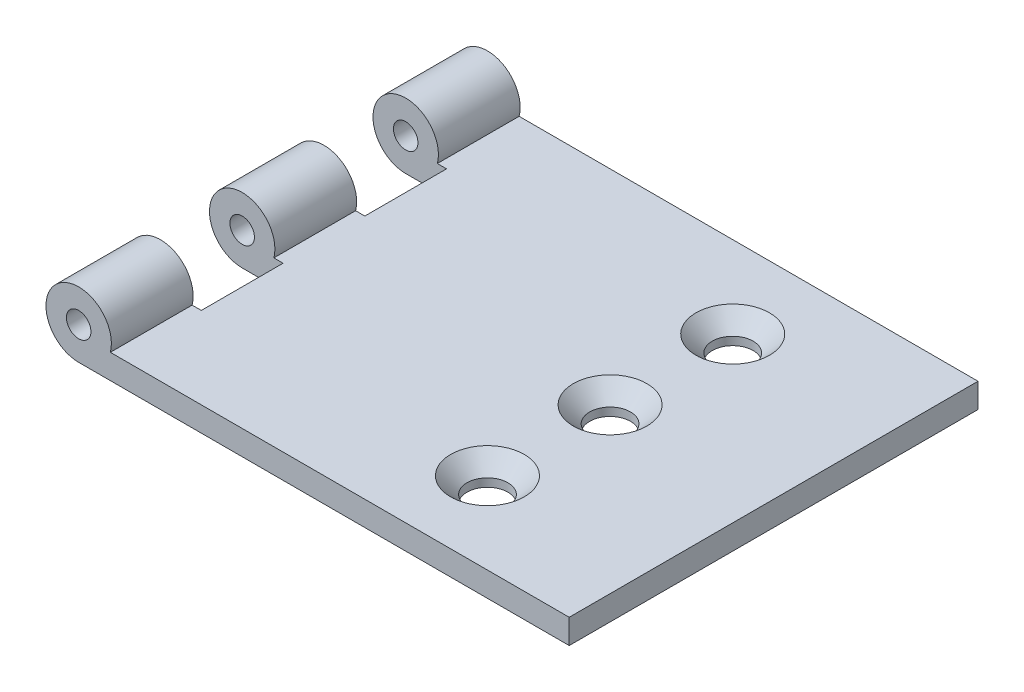
ISO-10303-21;
HEADER;
FILE_DESCRIPTION(('STEP AP214'),'2;1');
FILE_NAME('part.step','',(''),(''),'','','');
FILE_SCHEMA(('AUTOMOTIVE_DESIGN { 1 0 10303 214 1 1 1 1 }'));
ENDSEC;
DATA;
#1=APPLICATION_CONTEXT('core data for automotive mechanical design processes');
#2=APPLICATION_PROTOCOL_DEFINITION('international standard','automotive_design',2000,#1);
#3=PRODUCT_CONTEXT('',#1,'mechanical');
#4=PRODUCT('Part','Part','',(#3));
#5=PRODUCT_RELATED_PRODUCT_CATEGORY('part','',(#4));
#6=PRODUCT_DEFINITION_FORMATION('','',#4);
#7=PRODUCT_DEFINITION_CONTEXT('part definition',#1,'design');
#8=PRODUCT_DEFINITION('design','',#6,#7);
#9=PRODUCT_DEFINITION_SHAPE('','',#8);
#10=(LENGTH_UNIT() NAMED_UNIT(*) SI_UNIT(.MILLI.,.METRE.));
#11=(NAMED_UNIT(*) PLANE_ANGLE_UNIT() SI_UNIT($,.RADIAN.));
#12=(NAMED_UNIT(*) SI_UNIT($,.STERADIAN.) SOLID_ANGLE_UNIT());
#13=UNCERTAINTY_MEASURE_WITH_UNIT(LENGTH_MEASURE(1.E-05),#10,'distance_accuracy_value','');
#14=(GEOMETRIC_REPRESENTATION_CONTEXT(3) GLOBAL_UNCERTAINTY_ASSIGNED_CONTEXT((#13)) GLOBAL_UNIT_ASSIGNED_CONTEXT((#10,
#11,#12)) REPRESENTATION_CONTEXT('',''));
#15=CARTESIAN_POINT('',(0.,0.,0.));
#16=DIRECTION('',(0.,0.,1.));
#17=DIRECTION('',(1.,0.,0.));
#18=AXIS2_PLACEMENT_3D('',#15,#16,#17);
#19=CARTESIAN_POINT('',(40.,0.,15.));
#20=DIRECTION('',(0.,1.,0.));
#21=DIRECTION('',(0.,0.,1.));
#22=AXIS2_PLACEMENT_3D('',#19,#20,#21);
#23=CYLINDRICAL_SURFACE('',#22,2.5);
#24=CARTESIAN_POINT('',(40.,0.,15.));
#25=DIRECTION('',(0.,1.,0.));
#26=DIRECTION('',(0.,0.,1.));
#27=AXIS2_PLACEMENT_3D('',#24,#25,#26);
#28=CIRCLE('',#27,2.5);
#29=CARTESIAN_POINT('',(40.,0.,17.5));
#30=VERTEX_POINT('',#29);
#31=EDGE_CURVE('E307',#30,#30,#28,.T.);
#32=ORIENTED_EDGE('',*,*,#31,.F.);
#33=EDGE_LOOP('',(#32));
#34=FACE_BOUND('',#33,.T.);
#35=CARTESIAN_POINT('',(40.,1.,15.));
#36=DIRECTION('',(0.,-1.,0.));
#37=DIRECTION('',(0.,0.,-1.));
#38=AXIS2_PLACEMENT_3D('',#35,#36,#37);
#39=CIRCLE('',#38,2.5);
#40=CARTESIAN_POINT('',(40.,1.,12.5));
#41=VERTEX_POINT('',#40);
#42=EDGE_CURVE('E339',#41,#41,#39,.T.);
#43=ORIENTED_EDGE('',*,*,#42,.F.);
#44=EDGE_LOOP('',(#43));
#45=FACE_BOUND('',#44,.T.);
#46=ADVANCED_FACE('F51',(#34,#45),#23,.F.);
#47=CARTESIAN_POINT('',(40.,0.,0.));
#48=DIRECTION('',(0.,1.,0.));
#49=DIRECTION('',(0.,0.,1.));
#50=AXIS2_PLACEMENT_3D('',#47,#48,#49);
#51=CYLINDRICAL_SURFACE('',#50,2.5);
#52=CARTESIAN_POINT('',(40.,0.,0.));
#53=DIRECTION('',(0.,1.,0.));
#54=DIRECTION('',(0.,0.,1.));
#55=AXIS2_PLACEMENT_3D('',#52,#53,#54);
#56=CIRCLE('',#55,2.5);
#57=CARTESIAN_POINT('',(40.,0.,2.5));
#58=VERTEX_POINT('',#57);
#59=EDGE_CURVE('E311',#58,#58,#56,.T.);
#60=ORIENTED_EDGE('',*,*,#59,.F.);
#61=EDGE_LOOP('',(#60));
#62=FACE_BOUND('',#61,.T.);
#63=CARTESIAN_POINT('',(40.,1.,0.));
#64=DIRECTION('',(0.,-1.,0.));
#65=DIRECTION('',(0.,0.,-1.));
#66=AXIS2_PLACEMENT_3D('',#63,#64,#65);
#67=CIRCLE('',#66,2.5);
#68=CARTESIAN_POINT('',(40.,1.,-2.5));
#69=VERTEX_POINT('',#68);
#70=EDGE_CURVE('E331',#69,#69,#67,.T.);
#71=ORIENTED_EDGE('',*,*,#70,.F.);
#72=EDGE_LOOP('',(#71));
#73=FACE_BOUND('',#72,.T.);
#74=ADVANCED_FACE('F347',(#62,#73),#51,.F.);
#75=CARTESIAN_POINT('',(40.,0.,-15.));
#76=DIRECTION('',(0.,1.,0.));
#77=DIRECTION('',(0.,0.,1.));
#78=AXIS2_PLACEMENT_3D('',#75,#76,#77);
#79=CYLINDRICAL_SURFACE('',#78,2.5);
#80=CARTESIAN_POINT('',(40.,0.,-15.));
#81=DIRECTION('',(0.,1.,0.));
#82=DIRECTION('',(0.,0.,1.));
#83=AXIS2_PLACEMENT_3D('',#80,#81,#82);
#84=CIRCLE('',#83,2.5);
#85=CARTESIAN_POINT('',(40.,0.,-12.5));
#86=VERTEX_POINT('',#85);
#87=EDGE_CURVE('E316',#86,#86,#84,.T.);
#88=ORIENTED_EDGE('',*,*,#87,.F.);
#89=EDGE_LOOP('',(#88));
#90=FACE_BOUND('',#89,.T.);
#91=CARTESIAN_POINT('',(40.,1.,-15.));
#92=DIRECTION('',(0.,-1.,0.));
#93=DIRECTION('',(0.,0.,-1.));
#94=AXIS2_PLACEMENT_3D('',#91,#92,#93);
#95=CIRCLE('',#94,2.5);
#96=CARTESIAN_POINT('',(40.,1.,-17.5));
#97=VERTEX_POINT('',#96);
#98=EDGE_CURVE('E323',#97,#97,#95,.T.);
#99=ORIENTED_EDGE('',*,*,#98,.F.);
#100=EDGE_LOOP('',(#99));
#101=FACE_BOUND('',#100,.T.);
#102=ADVANCED_FACE('F352',(#90,#101),#79,.F.);
#103=CARTESIAN_POINT('',(0.,3.,0.));
#104=DIRECTION('',(0.,-1.,0.));
#105=DIRECTION('',(0.,0.,-1.));
#106=AXIS2_PLACEMENT_3D('',#103,#104,#105);
#107=PLANE('',#106);
#108=CARTESIAN_POINT('',(40.,3.,15.));
#109=DIRECTION('',(0.,-1.,0.));
#110=DIRECTION('',(0.,0.,-1.));
#111=AXIS2_PLACEMENT_3D('',#108,#109,#110);
#112=CIRCLE('',#111,4.5);
#113=CARTESIAN_POINT('',(40.,3.,10.5));
#114=VERTEX_POINT('',#113);
#115=EDGE_CURVE('E335',#114,#114,#112,.T.);
#116=ORIENTED_EDGE('',*,*,#115,.T.);
#117=EDGE_LOOP('',(#116));
#118=FACE_BOUND('',#117,.T.);
#119=CARTESIAN_POINT('',(40.,3.,0.));
#120=DIRECTION('',(0.,-1.,0.));
#121=DIRECTION('',(0.,0.,-1.));
#122=AXIS2_PLACEMENT_3D('',#119,#120,#121);
#123=CIRCLE('',#122,4.5);
#124=CARTESIAN_POINT('',(40.,3.,-4.5));
#125=VERTEX_POINT('',#124);
#126=EDGE_CURVE('E327',#125,#125,#123,.T.);
#127=ORIENTED_EDGE('',*,*,#126,.T.);
#128=EDGE_LOOP('',(#127));
#129=FACE_BOUND('',#128,.T.);
#130=CARTESIAN_POINT('',(40.,3.,-15.));
#131=DIRECTION('',(0.,-1.,0.));
#132=DIRECTION('',(0.,0.,-1.));
#133=AXIS2_PLACEMENT_3D('',#130,#131,#132);
#134=CIRCLE('',#133,4.5);
#135=CARTESIAN_POINT('',(40.,3.,-19.5));
#136=VERTEX_POINT('',#135);
#137=EDGE_CURVE('E312',#136,#136,#134,.T.);
#138=ORIENTED_EDGE('',*,*,#137,.T.);
#139=EDGE_LOOP('',(#138));
#140=FACE_BOUND('',#139,.T.);
#141=DIRECTION('',(0.,0.,-1.));
#142=VECTOR('',#141,1.);
#143=CARTESIAN_POINT('',(3.87298334620742,3.,5.));
#144=LINE('',#143,#142);
#145=CARTESIAN_POINT('',(3.87298334620742,3.,5.));
#146=VERTEX_POINT('',#145);
#147=CARTESIAN_POINT('',(3.87298334620742,3.,-5.));
#148=VERTEX_POINT('',#147);
#149=EDGE_CURVE('E73',#146,#148,#144,.T.);
#150=ORIENTED_EDGE('',*,*,#149,.F.);
#151=DIRECTION('',(1.,0.,0.));
#152=VECTOR('',#151,1.);
#153=CARTESIAN_POINT('',(5.,3.,5.));
#154=LINE('',#153,#152);
#155=CARTESIAN_POINT('',(5.,3.,5.));
#156=VERTEX_POINT('',#155);
#157=EDGE_CURVE('E210',#146,#156,#154,.T.);
#158=ORIENTED_EDGE('',*,*,#157,.T.);
#159=DIRECTION('',(0.,0.,1.));
#160=VECTOR('',#159,1.);
#161=CARTESIAN_POINT('',(5.,3.,15.));
#162=LINE('',#161,#160);
#163=CARTESIAN_POINT('',(5.,3.,15.));
#164=VERTEX_POINT('',#163);
#165=EDGE_CURVE('E213',#156,#164,#162,.T.);
#166=ORIENTED_EDGE('',*,*,#165,.T.);
#167=DIRECTION('',(-1.,0.,0.));
#168=VECTOR('',#167,1.);
#169=CARTESIAN_POINT('',(0.,3.,15.));
#170=LINE('',#169,#168);
#171=CARTESIAN_POINT('',(3.87298334620742,3.,15.));
#172=VERTEX_POINT('',#171);
#173=EDGE_CURVE('E216',#164,#172,#170,.T.);
#174=ORIENTED_EDGE('',*,*,#173,.T.);
#175=DIRECTION('',(0.,0.,-1.));
#176=VECTOR('',#175,1.);
#177=CARTESIAN_POINT('',(3.87298334620742,3.,25.));
#178=LINE('',#177,#176);
#179=CARTESIAN_POINT('',(3.87298334620742,3.,25.));
#180=VERTEX_POINT('',#179);
#181=EDGE_CURVE('E183',#180,#172,#178,.T.);
#182=ORIENTED_EDGE('',*,*,#181,.F.);
#183=DIRECTION('',(1.,0.,0.));
#184=VECTOR('',#183,1.);
#185=CARTESIAN_POINT('',(60.,3.,25.));
#186=LINE('',#185,#184);
#187=CARTESIAN_POINT('',(60.,3.,25.));
#188=VERTEX_POINT('',#187);
#189=EDGE_CURVE('E168',#180,#188,#186,.T.);
#190=ORIENTED_EDGE('',*,*,#189,.T.);
#191=DIRECTION('',(0.,0.,-1.));
#192=VECTOR('',#191,1.);
#193=CARTESIAN_POINT('',(60.,3.,-25.));
#194=LINE('',#193,#192);
#195=CARTESIAN_POINT('',(60.,3.,-25.));
#196=VERTEX_POINT('',#195);
#197=EDGE_CURVE('E221',#188,#196,#194,.T.);
#198=ORIENTED_EDGE('',*,*,#197,.T.);
#199=DIRECTION('',(-1.,0.,0.));
#200=VECTOR('',#199,1.);
#201=CARTESIAN_POINT('',(0.,3.,-25.));
#202=LINE('',#201,#200);
#203=CARTESIAN_POINT('',(3.87298334620742,3.,-25.));
#204=VERTEX_POINT('',#203);
#205=EDGE_CURVE('E224',#196,#204,#202,.T.);
#206=ORIENTED_EDGE('',*,*,#205,.T.);
#207=DIRECTION('',(0.,0.,-1.));
#208=VECTOR('',#207,1.);
#209=CARTESIAN_POINT('',(3.87298334620742,3.,-15.));
#210=LINE('',#209,#208);
#211=CARTESIAN_POINT('',(3.87298334620742,3.,-15.));
#212=VERTEX_POINT('',#211);
#213=EDGE_CURVE('E193',#212,#204,#210,.T.);
#214=ORIENTED_EDGE('',*,*,#213,.F.);
#215=DIRECTION('',(1.,0.,0.));
#216=VECTOR('',#215,1.);
#217=CARTESIAN_POINT('',(5.,3.,-15.));
#218=LINE('',#217,#216);
#219=CARTESIAN_POINT('',(5.,3.,-15.));
#220=VERTEX_POINT('',#219);
#221=EDGE_CURVE('E201',#212,#220,#218,.T.);
#222=ORIENTED_EDGE('',*,*,#221,.T.);
#223=DIRECTION('',(0.,0.,1.));
#224=VECTOR('',#223,1.);
#225=CARTESIAN_POINT('',(5.,3.,-5.));
#226=LINE('',#225,#224);
#227=CARTESIAN_POINT('',(5.,3.,-5.));
#228=VERTEX_POINT('',#227);
#229=EDGE_CURVE('E204',#220,#228,#226,.T.);
#230=ORIENTED_EDGE('',*,*,#229,.T.);
#231=DIRECTION('',(-1.,0.,0.));
#232=VECTOR('',#231,1.);
#233=CARTESIAN_POINT('',(0.,3.,-5.));
#234=LINE('',#233,#232);
#235=EDGE_CURVE('E69',#228,#148,#234,.T.);
#236=ORIENTED_EDGE('',*,*,#235,.T.);
#237=EDGE_LOOP('',(#150,#158,#166,#174,#182,#190,#198,#206,#214,#222,#230,#236));
#238=FACE_BOUND('',#237,.T.);
#239=ADVANCED_FACE('F381',(#118,#129,#140,#238),#107,.F.);
#240=CARTESIAN_POINT('',(5.,3.,-15.));
#241=DIRECTION('',(0.,0.,-1.));
#242=DIRECTION('',(-1.,0.,0.));
#243=AXIS2_PLACEMENT_3D('',#240,#241,#242);
#244=PLANE('',#243);
#245=CARTESIAN_POINT('',(0.,4.,-15.));
#246=DIRECTION('',(0.,0.,-1.));
#247=DIRECTION('',(-1.,0.,0.));
#248=AXIS2_PLACEMENT_3D('',#245,#246,#247);
#249=CIRCLE('',#248,1.5);
#250=CARTESIAN_POINT('',(-1.5,4.,-15.));
#251=VERTEX_POINT('',#250);
#252=EDGE_CURVE('E179',#251,#251,#249,.T.);
#253=ORIENTED_EDGE('',*,*,#252,.T.);
#254=EDGE_LOOP('',(#253));
#255=FACE_BOUND('',#254,.T.);
#256=CARTESIAN_POINT('',(0.,4.,-15.));
#257=DIRECTION('',(0.,0.,1.));
#258=DIRECTION('',(1.,0.,0.));
#259=AXIS2_PLACEMENT_3D('',#256,#257,#258);
#260=CIRCLE('',#259,4.);
#261=CARTESIAN_POINT('',(0.,0.,-15.));
#262=VERTEX_POINT('',#261);
#263=EDGE_CURVE('E189',#212,#262,#260,.T.);
#264=ORIENTED_EDGE('',*,*,#263,.T.);
#265=DIRECTION('',(1.,0.,0.));
#266=VECTOR('',#265,1.);
#267=CARTESIAN_POINT('',(5.,0.,-15.));
#268=LINE('',#267,#266);
#269=CARTESIAN_POINT('',(5.,0.,-15.));
#270=VERTEX_POINT('',#269);
#271=EDGE_CURVE('E231',#262,#270,#268,.T.);
#272=ORIENTED_EDGE('',*,*,#271,.T.);
#273=DIRECTION('',(0.,-1.,0.));
#274=VECTOR('',#273,1.);
#275=CARTESIAN_POINT('',(5.,3.,-15.));
#276=LINE('',#275,#274);
#277=EDGE_CURVE('E11',#220,#270,#276,.T.);
#278=ORIENTED_EDGE('',*,*,#277,.F.);
#279=ORIENTED_EDGE('',*,*,#221,.F.);
#280=EDGE_LOOP('',(#264,#272,#278,#279));
#281=FACE_BOUND('',#280,.T.);
#282=ADVANCED_FACE('F54',(#255,#281),#244,.F.);
#283=CARTESIAN_POINT('',(5.,3.,-5.));
#284=DIRECTION('',(1.,0.,0.));
#285=DIRECTION('',(0.,0.,-1.));
#286=AXIS2_PLACEMENT_3D('',#283,#284,#285);
#287=PLANE('',#286);
#288=DIRECTION('',(0.,0.,1.));
#289=VECTOR('',#288,1.);
#290=CARTESIAN_POINT('',(5.,0.,-5.));
#291=LINE('',#290,#289);
#292=CARTESIAN_POINT('',(5.,0.,-5.));
#293=VERTEX_POINT('',#292);
#294=EDGE_CURVE('E234',#270,#293,#291,.T.);
#295=ORIENTED_EDGE('',*,*,#294,.T.);
#296=DIRECTION('',(0.,-1.,0.));
#297=VECTOR('',#296,1.);
#298=CARTESIAN_POINT('',(5.,3.,-5.));
#299=LINE('',#298,#297);
#300=EDGE_CURVE('E62',#228,#293,#299,.T.);
#301=ORIENTED_EDGE('',*,*,#300,.F.);
#302=ORIENTED_EDGE('',*,*,#229,.F.);
#303=ORIENTED_EDGE('',*,*,#277,.T.);
#304=EDGE_LOOP('',(#295,#301,#302,#303));
#305=FACE_BOUND('',#304,.T.);
#306=ADVANCED_FACE('F421',(#305),#287,.F.);
#307=CARTESIAN_POINT('',(0.,3.,-5.));
#308=DIRECTION('',(0.,0.,1.));
#309=DIRECTION('',(1.,0.,0.));
#310=AXIS2_PLACEMENT_3D('',#307,#308,#309);
#311=PLANE('',#310);
#312=CARTESIAN_POINT('',(0.,4.,-5.));
#313=DIRECTION('',(0.,0.,1.));
#314=DIRECTION('',(1.,0.,0.));
#315=AXIS2_PLACEMENT_3D('',#312,#313,#314);
#316=CIRCLE('',#315,1.5);
#317=CARTESIAN_POINT('',(1.5,4.,-5.));
#318=VERTEX_POINT('',#317);
#319=EDGE_CURVE('E292',#318,#318,#316,.T.);
#320=ORIENTED_EDGE('',*,*,#319,.T.);
#321=EDGE_LOOP('',(#320));
#322=FACE_BOUND('',#321,.T.);
#323=DIRECTION('',(-1.,0.,0.));
#324=VECTOR('',#323,1.);
#325=CARTESIAN_POINT('',(0.,0.,-5.));
#326=LINE('',#325,#324);
#327=CARTESIAN_POINT('',(0.,0.,-5.));
#328=VERTEX_POINT('',#327);
#329=EDGE_CURVE('E237',#293,#328,#326,.T.);
#330=ORIENTED_EDGE('',*,*,#329,.T.);
#331=CARTESIAN_POINT('',(0.,4.,-5.));
#332=DIRECTION('',(0.,0.,1.));
#333=DIRECTION('',(1.,0.,0.));
#334=AXIS2_PLACEMENT_3D('',#331,#332,#333);
#335=CIRCLE('',#334,4.);
#336=EDGE_CURVE('E170',#148,#328,#335,.T.);
#337=ORIENTED_EDGE('',*,*,#336,.F.);
#338=ORIENTED_EDGE('',*,*,#235,.F.);
#339=ORIENTED_EDGE('',*,*,#300,.T.);
#340=EDGE_LOOP('',(#330,#337,#338,#339));
#341=FACE_BOUND('',#340,.T.);
#342=ADVANCED_FACE('F275',(#322,#341),#311,.F.);
#343=CARTESIAN_POINT('',(5.,3.,5.));
#344=DIRECTION('',(0.,0.,-1.));
#345=DIRECTION('',(-1.,0.,0.));
#346=AXIS2_PLACEMENT_3D('',#343,#344,#345);
#347=PLANE('',#346);
#348=CARTESIAN_POINT('',(0.,4.,5.));
#349=DIRECTION('',(0.,0.,-1.));
#350=DIRECTION('',(-1.,0.,0.));
#351=AXIS2_PLACEMENT_3D('',#348,#349,#350);
#352=CIRCLE('',#351,1.5);
#353=CARTESIAN_POINT('',(-1.5,4.,5.));
#354=VERTEX_POINT('',#353);
#355=EDGE_CURVE('E295',#354,#354,#352,.T.);
#356=ORIENTED_EDGE('',*,*,#355,.T.);
#357=EDGE_LOOP('',(#356));
#358=FACE_BOUND('',#357,.T.);
#359=ORIENTED_EDGE('',*,*,#157,.F.);
#360=CARTESIAN_POINT('',(0.,4.,5.));
#361=DIRECTION('',(0.,0.,1.));
#362=DIRECTION('',(1.,0.,0.));
#363=AXIS2_PLACEMENT_3D('',#360,#361,#362);
#364=CIRCLE('',#363,4.);
#365=CARTESIAN_POINT('',(0.,0.,5.));
#366=VERTEX_POINT('',#365);
#367=EDGE_CURVE('E176',#146,#366,#364,.T.);
#368=ORIENTED_EDGE('',*,*,#367,.T.);
#369=DIRECTION('',(1.,0.,0.));
#370=VECTOR('',#369,1.);
#371=CARTESIAN_POINT('',(5.,0.,5.));
#372=LINE('',#371,#370);
#373=CARTESIAN_POINT('',(5.,0.,5.));
#374=VERTEX_POINT('',#373);
#375=EDGE_CURVE('E244',#366,#374,#372,.T.);
#376=ORIENTED_EDGE('',*,*,#375,.T.);
#377=DIRECTION('',(0.,-1.,0.));
#378=VECTOR('',#377,1.);
#379=CARTESIAN_POINT('',(5.,3.,5.));
#380=LINE('',#379,#378);
#381=EDGE_CURVE('E265',#156,#374,#380,.T.);
#382=ORIENTED_EDGE('',*,*,#381,.F.);
#383=EDGE_LOOP('',(#359,#368,#376,#382));
#384=FACE_BOUND('',#383,.T.);
#385=ADVANCED_FACE('F413',(#358,#384),#347,.F.);
#386=CARTESIAN_POINT('',(5.,3.,15.));
#387=DIRECTION('',(1.,0.,0.));
#388=DIRECTION('',(0.,0.,-1.));
#389=AXIS2_PLACEMENT_3D('',#386,#387,#388);
#390=PLANE('',#389);
#391=DIRECTION('',(0.,0.,1.));
#392=VECTOR('',#391,1.);
#393=CARTESIAN_POINT('',(5.,0.,15.));
#394=LINE('',#393,#392);
#395=CARTESIAN_POINT('',(5.,0.,15.));
#396=VERTEX_POINT('',#395);
#397=EDGE_CURVE('E247',#374,#396,#394,.T.);
#398=ORIENTED_EDGE('',*,*,#397,.T.);
#399=DIRECTION('',(0.,-1.,0.));
#400=VECTOR('',#399,1.);
#401=CARTESIAN_POINT('',(5.,3.,15.));
#402=LINE('',#401,#400);
#403=EDGE_CURVE('E261',#164,#396,#402,.T.);
#404=ORIENTED_EDGE('',*,*,#403,.F.);
#405=ORIENTED_EDGE('',*,*,#165,.F.);
#406=ORIENTED_EDGE('',*,*,#381,.T.);
#407=EDGE_LOOP('',(#398,#404,#405,#406));
#408=FACE_BOUND('',#407,.T.);
#409=ADVANCED_FACE('F408',(#408),#390,.F.);
#410=CARTESIAN_POINT('',(0.,3.,15.));
#411=DIRECTION('',(0.,0.,1.));
#412=DIRECTION('',(1.,0.,0.));
#413=AXIS2_PLACEMENT_3D('',#410,#411,#412);
#414=PLANE('',#413);
#415=CARTESIAN_POINT('',(0.,4.,15.));
#416=DIRECTION('',(0.,0.,1.));
#417=DIRECTION('',(1.,0.,0.));
#418=AXIS2_PLACEMENT_3D('',#415,#416,#417);
#419=CIRCLE('',#418,1.5);
#420=CARTESIAN_POINT('',(1.5,4.,15.));
#421=VERTEX_POINT('',#420);
#422=EDGE_CURVE('E299',#421,#421,#419,.T.);
#423=ORIENTED_EDGE('',*,*,#422,.T.);
#424=EDGE_LOOP('',(#423));
#425=FACE_BOUND('',#424,.T.);
#426=DIRECTION('',(-1.,0.,0.));
#427=VECTOR('',#426,1.);
#428=CARTESIAN_POINT('',(0.,0.,15.));
#429=LINE('',#428,#427);
#430=CARTESIAN_POINT('',(0.,0.,15.));
#431=VERTEX_POINT('',#430);
#432=EDGE_CURVE('E164',#396,#431,#429,.T.);
#433=ORIENTED_EDGE('',*,*,#432,.T.);
#434=CARTESIAN_POINT('',(0.,4.,15.));
#435=DIRECTION('',(0.,0.,1.));
#436=DIRECTION('',(1.,0.,0.));
#437=AXIS2_PLACEMENT_3D('',#434,#435,#436);
#438=CIRCLE('',#437,4.);
#439=EDGE_CURVE('E162',#172,#431,#438,.T.);
#440=ORIENTED_EDGE('',*,*,#439,.F.);
#441=ORIENTED_EDGE('',*,*,#173,.F.);
#442=ORIENTED_EDGE('',*,*,#403,.T.);
#443=EDGE_LOOP('',(#433,#440,#441,#442));
#444=FACE_BOUND('',#443,.T.);
#445=ADVANCED_FACE('F403',(#425,#444),#414,.F.);
#446=CARTESIAN_POINT('',(60.,3.,25.));
#447=DIRECTION('',(0.,0.,-1.));
#448=DIRECTION('',(-1.,0.,0.));
#449=AXIS2_PLACEMENT_3D('',#446,#447,#448);
#450=PLANE('',#449);
#451=CARTESIAN_POINT('',(0.,4.,25.));
#452=DIRECTION('',(0.,0.,-1.));
#453=DIRECTION('',(-1.,0.,0.));
#454=AXIS2_PLACEMENT_3D('',#451,#452,#453);
#455=CIRCLE('',#454,1.5);
#456=CARTESIAN_POINT('',(-1.5,4.,25.));
#457=VERTEX_POINT('',#456);
#458=EDGE_CURVE('E303',#457,#457,#455,.T.);
#459=ORIENTED_EDGE('',*,*,#458,.T.);
#460=EDGE_LOOP('',(#459));
#461=FACE_BOUND('',#460,.T.);
#462=ORIENTED_EDGE('',*,*,#189,.F.);
#463=CARTESIAN_POINT('',(0.,4.,25.));
#464=DIRECTION('',(0.,0.,1.));
#465=DIRECTION('',(1.,0.,0.));
#466=AXIS2_PLACEMENT_3D('',#463,#464,#465);
#467=CIRCLE('',#466,4.);
#468=CARTESIAN_POINT('',(0.,0.,25.));
#469=VERTEX_POINT('',#468);
#470=EDGE_CURVE('E160',#180,#469,#467,.T.);
#471=ORIENTED_EDGE('',*,*,#470,.T.);
#472=DIRECTION('',(1.,0.,0.));
#473=VECTOR('',#472,1.);
#474=CARTESIAN_POINT('',(60.,0.,25.));
#475=LINE('',#474,#473);
#476=CARTESIAN_POINT('',(60.,0.,25.));
#477=VERTEX_POINT('',#476);
#478=EDGE_CURVE('E141',#469,#477,#475,.T.);
#479=ORIENTED_EDGE('',*,*,#478,.T.);
#480=DIRECTION('',(0.,-1.,0.));
#481=VECTOR('',#480,1.);
#482=CARTESIAN_POINT('',(60.,3.,25.));
#483=LINE('',#482,#481);
#484=EDGE_CURVE('E258',#188,#477,#483,.T.);
#485=ORIENTED_EDGE('',*,*,#484,.F.);
#486=EDGE_LOOP('',(#462,#471,#479,#485));
#487=FACE_BOUND('',#486,.T.);
#488=ADVANCED_FACE('F167',(#461,#487),#450,.F.);
#489=CARTESIAN_POINT('',(60.,3.,-25.));
#490=DIRECTION('',(-1.,0.,0.));
#491=DIRECTION('',(0.,0.,1.));
#492=AXIS2_PLACEMENT_3D('',#489,#490,#491);
#493=PLANE('',#492);
#494=DIRECTION('',(0.,0.,-1.));
#495=VECTOR('',#494,1.);
#496=CARTESIAN_POINT('',(60.,0.,-25.));
#497=LINE('',#496,#495);
#498=CARTESIAN_POINT('',(60.,0.,-25.));
#499=VERTEX_POINT('',#498);
#500=EDGE_CURVE('E149',#477,#499,#497,.T.);
#501=ORIENTED_EDGE('',*,*,#500,.T.);
#502=DIRECTION('',(0.,-1.,0.));
#503=VECTOR('',#502,1.);
#504=CARTESIAN_POINT('',(60.,3.,-25.));
#505=LINE('',#504,#503);
#506=EDGE_CURVE('E227',#196,#499,#505,.T.);
#507=ORIENTED_EDGE('',*,*,#506,.F.);
#508=ORIENTED_EDGE('',*,*,#197,.F.);
#509=ORIENTED_EDGE('',*,*,#484,.T.);
#510=EDGE_LOOP('',(#501,#507,#508,#509));
#511=FACE_BOUND('',#510,.T.);
#512=ADVANCED_FACE('F394',(#511),#493,.F.);
#513=CARTESIAN_POINT('',(0.,3.,-25.));
#514=DIRECTION('',(0.,0.,1.));
#515=DIRECTION('',(1.,0.,0.));
#516=AXIS2_PLACEMENT_3D('',#513,#514,#515);
#517=PLANE('',#516);
#518=CARTESIAN_POINT('',(0.,4.,-25.));
#519=DIRECTION('',(0.,0.,1.));
#520=DIRECTION('',(1.,0.,0.));
#521=AXIS2_PLACEMENT_3D('',#518,#519,#520);
#522=CIRCLE('',#521,1.5);
#523=CARTESIAN_POINT('',(1.5,4.,-25.));
#524=VERTEX_POINT('',#523);
#525=EDGE_CURVE('E56',#524,#524,#522,.T.);
#526=ORIENTED_EDGE('',*,*,#525,.T.);
#527=EDGE_LOOP('',(#526));
#528=FACE_BOUND('',#527,.T.);
#529=DIRECTION('',(-1.,0.,0.));
#530=VECTOR('',#529,1.);
#531=CARTESIAN_POINT('',(0.,0.,-25.));
#532=LINE('',#531,#530);
#533=CARTESIAN_POINT('',(0.,0.,-25.));
#534=VERTEX_POINT('',#533);
#535=EDGE_CURVE('E205',#499,#534,#532,.T.);
#536=ORIENTED_EDGE('',*,*,#535,.T.);
#537=CARTESIAN_POINT('',(0.,4.,-25.));
#538=DIRECTION('',(0.,0.,1.));
#539=DIRECTION('',(1.,0.,0.));
#540=AXIS2_PLACEMENT_3D('',#537,#538,#539);
#541=CIRCLE('',#540,4.);
#542=EDGE_CURVE('E188',#204,#534,#541,.T.);
#543=ORIENTED_EDGE('',*,*,#542,.F.);
#544=ORIENTED_EDGE('',*,*,#205,.F.);
#545=ORIENTED_EDGE('',*,*,#506,.T.);
#546=EDGE_LOOP('',(#536,#543,#544,#545));
#547=FACE_BOUND('',#546,.T.);
#548=ADVANCED_FACE('F389',(#528,#547),#517,.F.);
#549=CARTESIAN_POINT('',(0.,0.,0.));
#550=DIRECTION('',(0.,-1.,0.));
#551=DIRECTION('',(0.,0.,-1.));
#552=AXIS2_PLACEMENT_3D('',#549,#550,#551);
#553=PLANE('',#552);
#554=ORIENTED_EDGE('',*,*,#87,.T.);
#555=EDGE_LOOP('',(#554));
#556=FACE_BOUND('',#555,.T.);
#557=ORIENTED_EDGE('',*,*,#59,.T.);
#558=EDGE_LOOP('',(#557));
#559=FACE_BOUND('',#558,.T.);
#560=ORIENTED_EDGE('',*,*,#31,.T.);
#561=EDGE_LOOP('',(#560));
#562=FACE_BOUND('',#561,.T.);
#563=DIRECTION('',(0.,0.,1.));
#564=VECTOR('',#563,1.);
#565=CARTESIAN_POINT('',(0.,0.,-15.));
#566=LINE('',#565,#564);
#567=EDGE_CURVE('E200',#534,#262,#566,.T.);
#568=ORIENTED_EDGE('',*,*,#567,.F.);
#569=ORIENTED_EDGE('',*,*,#535,.F.);
#570=ORIENTED_EDGE('',*,*,#500,.F.);
#571=ORIENTED_EDGE('',*,*,#478,.F.);
#572=DIRECTION('',(0.,0.,1.));
#573=VECTOR('',#572,1.);
#574=CARTESIAN_POINT('',(0.,0.,25.));
#575=LINE('',#574,#573);
#576=EDGE_CURVE('E146',#431,#469,#575,.T.);
#577=ORIENTED_EDGE('',*,*,#576,.F.);
#578=ORIENTED_EDGE('',*,*,#432,.F.);
#579=ORIENTED_EDGE('',*,*,#397,.F.);
#580=ORIENTED_EDGE('',*,*,#375,.F.);
#581=DIRECTION('',(0.,0.,1.));
#582=VECTOR('',#581,1.);
#583=CARTESIAN_POINT('',(0.,0.,5.));
#584=LINE('',#583,#582);
#585=EDGE_CURVE('E240',#328,#366,#584,.T.);
#586=ORIENTED_EDGE('',*,*,#585,.F.);
#587=ORIENTED_EDGE('',*,*,#329,.F.);
#588=ORIENTED_EDGE('',*,*,#294,.F.);
#589=ORIENTED_EDGE('',*,*,#271,.F.);
#590=EDGE_LOOP('',(#568,#569,#570,#571,#577,#578,#579,#580,#586,#587,#588,#589));
#591=FACE_BOUND('',#590,.T.);
#592=ADVANCED_FACE('F144',(#556,#559,#562,#591),#553,.T.);
#593=CARTESIAN_POINT('',(0.,4.,-15.));
#594=DIRECTION('',(0.,0.,-1.));
#595=DIRECTION('',(-1.,0.,0.));
#596=AXIS2_PLACEMENT_3D('',#593,#594,#595);
#597=CYLINDRICAL_SURFACE('',#596,4.);
#598=ORIENTED_EDGE('',*,*,#263,.F.);
#599=ORIENTED_EDGE('',*,*,#213,.T.);
#600=ORIENTED_EDGE('',*,*,#542,.T.);
#601=ORIENTED_EDGE('',*,*,#567,.T.);
#602=EDGE_LOOP('',(#598,#599,#600,#601));
#603=FACE_BOUND('',#602,.T.);
#604=ADVANCED_FACE('F375',(#603),#597,.T.);
#605=CARTESIAN_POINT('',(0.,4.,25.));
#606=DIRECTION('',(0.,0.,-1.));
#607=DIRECTION('',(-1.,0.,0.));
#608=AXIS2_PLACEMENT_3D('',#605,#606,#607);
#609=CYLINDRICAL_SURFACE('',#608,4.);
#610=ORIENTED_EDGE('',*,*,#470,.F.);
#611=ORIENTED_EDGE('',*,*,#181,.T.);
#612=ORIENTED_EDGE('',*,*,#439,.T.);
#613=ORIENTED_EDGE('',*,*,#576,.T.);
#614=EDGE_LOOP('',(#610,#611,#612,#613));
#615=FACE_BOUND('',#614,.T.);
#616=ADVANCED_FACE('F158',(#615),#609,.T.);
#617=CARTESIAN_POINT('',(0.,4.,5.));
#618=DIRECTION('',(0.,0.,-1.));
#619=DIRECTION('',(-1.,0.,0.));
#620=AXIS2_PLACEMENT_3D('',#617,#618,#619);
#621=CYLINDRICAL_SURFACE('',#620,4.);
#622=ORIENTED_EDGE('',*,*,#367,.F.);
#623=ORIENTED_EDGE('',*,*,#149,.T.);
#624=ORIENTED_EDGE('',*,*,#336,.T.);
#625=ORIENTED_EDGE('',*,*,#585,.T.);
#626=EDGE_LOOP('',(#622,#623,#624,#625));
#627=FACE_BOUND('',#626,.T.);
#628=ADVANCED_FACE('F285',(#627),#621,.T.);
#629=CARTESIAN_POINT('',(0.,4.,-90.));
#630=DIRECTION('',(0.,0.,1.));
#631=DIRECTION('',(1.,0.,0.));
#632=AXIS2_PLACEMENT_3D('',#629,#630,#631);
#633=CYLINDRICAL_SURFACE('',#632,1.5);
#634=ORIENTED_EDGE('',*,*,#525,.F.);
#635=EDGE_LOOP('',(#634));
#636=FACE_BOUND('',#635,.T.);
#637=ORIENTED_EDGE('',*,*,#252,.F.);
#638=EDGE_LOOP('',(#637));
#639=FACE_BOUND('',#638,.T.);
#640=ADVANCED_FACE('F361',(#636,#639),#633,.F.);
#641=ORIENTED_EDGE('',*,*,#458,.F.);
#642=EDGE_LOOP('',(#641));
#643=FACE_BOUND('',#642,.T.);
#644=ORIENTED_EDGE('',*,*,#422,.F.);
#645=EDGE_LOOP('',(#644));
#646=FACE_BOUND('',#645,.T.);
#647=ADVANCED_FACE('F366',(#643,#646),#633,.F.);
#648=ORIENTED_EDGE('',*,*,#355,.F.);
#649=EDGE_LOOP('',(#648));
#650=FACE_BOUND('',#649,.T.);
#651=ORIENTED_EDGE('',*,*,#319,.F.);
#652=EDGE_LOOP('',(#651));
#653=FACE_BOUND('',#652,.T.);
#654=ADVANCED_FACE('F368',(#650,#653),#633,.F.);
#655=CARTESIAN_POINT('',(40.,3.,-15.));
#656=DIRECTION('',(0.,1.,0.));
#657=DIRECTION('',(0.,0.,1.));
#658=AXIS2_PLACEMENT_3D('',#655,#656,#657);
#659=CONICAL_SURFACE('',#658,4.5,0.785398163397448);
#660=ORIENTED_EDGE('',*,*,#98,.T.);
#661=EDGE_LOOP('',(#660));
#662=FACE_BOUND('',#661,.T.);
#663=ORIENTED_EDGE('',*,*,#137,.F.);
#664=EDGE_LOOP('',(#663));
#665=FACE_BOUND('',#664,.T.);
#666=ADVANCED_FACE('F484',(#662,#665),#659,.F.);
#667=CARTESIAN_POINT('',(40.,3.,0.));
#668=DIRECTION('',(0.,1.,0.));
#669=DIRECTION('',(0.,0.,1.));
#670=AXIS2_PLACEMENT_3D('',#667,#668,#669);
#671=CONICAL_SURFACE('',#670,4.5,0.785398163397448);
#672=ORIENTED_EDGE('',*,*,#70,.T.);
#673=EDGE_LOOP('',(#672));
#674=FACE_BOUND('',#673,.T.);
#675=ORIENTED_EDGE('',*,*,#126,.F.);
#676=EDGE_LOOP('',(#675));
#677=FACE_BOUND('',#676,.T.);
#678=ADVANCED_FACE('F464',(#674,#677),#671,.F.);
#679=CARTESIAN_POINT('',(40.,3.,15.));
#680=DIRECTION('',(0.,1.,0.));
#681=DIRECTION('',(0.,0.,1.));
#682=AXIS2_PLACEMENT_3D('',#679,#680,#681);
#683=CONICAL_SURFACE('',#682,4.5,0.785398163397448);
#684=ORIENTED_EDGE('',*,*,#42,.T.);
#685=EDGE_LOOP('',(#684));
#686=FACE_BOUND('',#685,.T.);
#687=ORIENTED_EDGE('',*,*,#115,.F.);
#688=EDGE_LOOP('',(#687));
#689=FACE_BOUND('',#688,.T.);
#690=ADVANCED_FACE('F343',(#686,#689),#683,.F.);
#691=CLOSED_SHELL('',(#46,#74,#102,#239,#282,#306,#342,#385,#409,#445,#488,#512,#548,#592,#604,
#616,#628,#640,#647,#654,#666,#678,#690));
#692=MANIFOLD_SOLID_BREP('B2',#691);
#693=ADVANCED_BREP_SHAPE_REPRESENTATION('',(#18,#692),#14);
#694=SHAPE_DEFINITION_REPRESENTATION(#9,#693);
ENDSEC;
END-ISO-10303-21;
